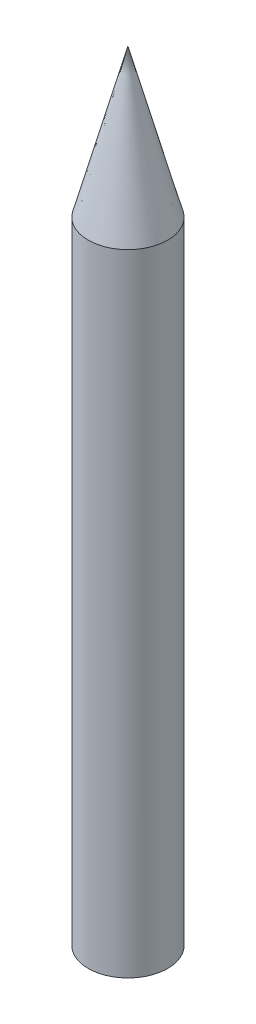
ISO-10303-21;
HEADER;
FILE_DESCRIPTION(('STEP AP214'),'2;1');
FILE_NAME('part.step','',(''),(''),'','','');
FILE_SCHEMA(('AUTOMOTIVE_DESIGN { 1 0 10303 214 1 1 1 1 }'));
ENDSEC;
DATA;
#1=APPLICATION_CONTEXT('core data for automotive mechanical design processes');
#2=APPLICATION_PROTOCOL_DEFINITION('international standard','automotive_design',2000,#1);
#3=PRODUCT_CONTEXT('',#1,'mechanical');
#4=PRODUCT('Part','Part','',(#3));
#5=PRODUCT_RELATED_PRODUCT_CATEGORY('part','',(#4));
#6=PRODUCT_DEFINITION_FORMATION('','',#4);
#7=PRODUCT_DEFINITION_CONTEXT('part definition',#1,'design');
#8=PRODUCT_DEFINITION('design','',#6,#7);
#9=PRODUCT_DEFINITION_SHAPE('','',#8);
#10=(LENGTH_UNIT() NAMED_UNIT(*) SI_UNIT(.MILLI.,.METRE.));
#11=(NAMED_UNIT(*) PLANE_ANGLE_UNIT() SI_UNIT($,.RADIAN.));
#12=(NAMED_UNIT(*) SI_UNIT($,.STERADIAN.) SOLID_ANGLE_UNIT());
#13=UNCERTAINTY_MEASURE_WITH_UNIT(LENGTH_MEASURE(1.E-05),#10,'distance_accuracy_value','');
#14=(GEOMETRIC_REPRESENTATION_CONTEXT(3) GLOBAL_UNCERTAINTY_ASSIGNED_CONTEXT((#13)) GLOBAL_UNIT_ASSIGNED_CONTEXT((#10,
#11,#12)) REPRESENTATION_CONTEXT('',''));
#15=CARTESIAN_POINT('',(0.,0.,0.));
#16=DIRECTION('',(0.,0.,1.));
#17=DIRECTION('',(1.,0.,0.));
#18=AXIS2_PLACEMENT_3D('',#15,#16,#17);
#19=CARTESIAN_POINT('',(0.,-1.90334591186018,0.));
#20=DIRECTION('',(0.,-1.,0.));
#21=DIRECTION('',(0.,0.,-1.));
#22=AXIS2_PLACEMENT_3D('',#19,#20,#21);
#23=CONICAL_SURFACE('',#22,0.510000000000002,0.261799387799143);
#24=CARTESIAN_POINT('',(0.,0.,0.));
#25=VERTEX_POINT('',#24);
#26=VERTEX_LOOP('',#25);
#27=FACE_BOUND('',#26,.T.);
#28=CARTESIAN_POINT('',(0.,-1.90334591186018,0.));
#29=DIRECTION('',(0.,1.,0.));
#30=DIRECTION('',(0.,0.,1.));
#31=AXIS2_PLACEMENT_3D('',#28,#29,#30);
#32=CIRCLE('',#31,0.510000000000002);
#33=CARTESIAN_POINT('',(0.,-1.90334591186018,0.510000000000002));
#34=VERTEX_POINT('',#33);
#35=EDGE_CURVE('E11',#34,#34,#32,.T.);
#36=ORIENTED_EDGE('',*,*,#35,.T.);
#37=EDGE_LOOP('',(#36));
#38=FACE_BOUND('',#37,.T.);
#39=ADVANCED_FACE('F35',(#27,#38),#23,.T.);
#40=CARTESIAN_POINT('',(0.,0.,0.));
#41=DIRECTION('',(0.,1.,0.));
#42=DIRECTION('',(0.,0.,1.));
#43=AXIS2_PLACEMENT_3D('',#40,#41,#42);
#44=CYLINDRICAL_SURFACE('',#43,0.510000000000001);
#45=ORIENTED_EDGE('',*,*,#35,.F.);
#46=EDGE_LOOP('',(#45));
#47=FACE_BOUND('',#46,.T.);
#48=CARTESIAN_POINT('',(0.,-10.,0.));
#49=DIRECTION('',(0.,1.,0.));
#50=DIRECTION('',(0.,0.,1.));
#51=AXIS2_PLACEMENT_3D('',#48,#49,#50);
#52=CIRCLE('',#51,0.510000000000001);
#53=CARTESIAN_POINT('',(0.,-10.,0.509999999999999));
#54=VERTEX_POINT('',#53);
#55=EDGE_CURVE('E41',#54,#54,#52,.T.);
#56=ORIENTED_EDGE('',*,*,#55,.T.);
#57=EDGE_LOOP('',(#56));
#58=FACE_BOUND('',#57,.T.);
#59=ADVANCED_FACE('F46',(#47,#58),#44,.T.);
#60=CARTESIAN_POINT('',(0.,-10.,0.));
#61=DIRECTION('',(0.,1.,0.));
#62=DIRECTION('',(0.,0.,1.));
#63=AXIS2_PLACEMENT_3D('',#60,#61,#62);
#64=PLANE('',#63);
#65=ORIENTED_EDGE('',*,*,#55,.F.);
#66=EDGE_LOOP('',(#65));
#67=FACE_BOUND('',#66,.T.);
#68=ADVANCED_FACE('F51',(#67),#64,.F.);
#69=CLOSED_SHELL('',(#39,#59,#68));
#70=MANIFOLD_SOLID_BREP('B2',#69);
#71=ADVANCED_BREP_SHAPE_REPRESENTATION('',(#18,#70),#14);
#72=SHAPE_DEFINITION_REPRESENTATION(#9,#71);
ENDSEC;
END-ISO-10303-21;
